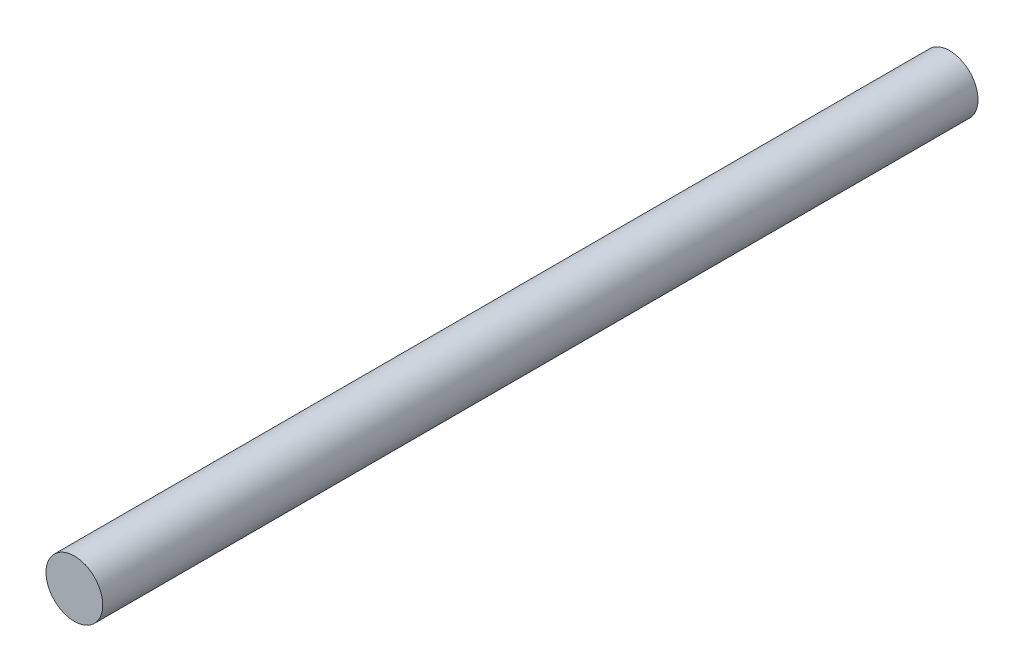
ISO-10303-21;
HEADER;
FILE_DESCRIPTION(('STEP AP214'),'2;1');
FILE_NAME('part.step','',(''),(''),'','','');
FILE_SCHEMA(('AUTOMOTIVE_DESIGN { 1 0 10303 214 1 1 1 1 }'));
ENDSEC;
DATA;
#1=APPLICATION_CONTEXT('core data for automotive mechanical design processes');
#2=APPLICATION_PROTOCOL_DEFINITION('international standard','automotive_design',2000,#1);
#3=PRODUCT_CONTEXT('',#1,'mechanical');
#4=PRODUCT('Part','Part','',(#3));
#5=PRODUCT_RELATED_PRODUCT_CATEGORY('part','',(#4));
#6=PRODUCT_DEFINITION_FORMATION('','',#4);
#7=PRODUCT_DEFINITION_CONTEXT('part definition',#1,'design');
#8=PRODUCT_DEFINITION('design','',#6,#7);
#9=PRODUCT_DEFINITION_SHAPE('','',#8);
#10=(LENGTH_UNIT() NAMED_UNIT(*) SI_UNIT(.MILLI.,.METRE.));
#11=(NAMED_UNIT(*) PLANE_ANGLE_UNIT() SI_UNIT($,.RADIAN.));
#12=(NAMED_UNIT(*) SI_UNIT($,.STERADIAN.) SOLID_ANGLE_UNIT());
#13=UNCERTAINTY_MEASURE_WITH_UNIT(LENGTH_MEASURE(1.E-05),#10,'distance_accuracy_value','');
#14=(GEOMETRIC_REPRESENTATION_CONTEXT(3) GLOBAL_UNCERTAINTY_ASSIGNED_CONTEXT((#13)) GLOBAL_UNIT_ASSIGNED_CONTEXT((#10,
#11,#12)) REPRESENTATION_CONTEXT('',''));
#15=CARTESIAN_POINT('',(0.,0.,0.));
#16=DIRECTION('',(0.,0.,1.));
#17=DIRECTION('',(1.,0.,0.));
#18=AXIS2_PLACEMENT_3D('',#15,#16,#17);
#19=CARTESIAN_POINT('',(139.1866152,19.2438528000001,0.));
#20=DIRECTION('',(0.,0.,1.));
#21=DIRECTION('',(1.,0.,0.));
#22=AXIS2_PLACEMENT_3D('',#19,#20,#21);
#23=PLANE('',#22);
#24=CARTESIAN_POINT('',(139.1866152,19.2438528000001,0.));
#25=DIRECTION('',(0.,0.,1.));
#26=DIRECTION('',(1.,0.,0.));
#27=AXIS2_PLACEMENT_3D('',#24,#25,#26);
#28=CIRCLE('',#27,11.1125);
#29=CARTESIAN_POINT('',(150.2991152,19.2438528000001,0.));
#30=VERTEX_POINT('',#29);
#31=EDGE_CURVE('E38',#30,#30,#28,.T.);
#32=ORIENTED_EDGE('',*,*,#31,.F.);
#33=EDGE_LOOP('',(#32));
#34=FACE_BOUND('',#33,.T.);
#35=ADVANCED_FACE('F31',(#34),#23,.F.);
#36=CARTESIAN_POINT('',(139.1866152,19.2438528000001,374.330896423742));
#37=DIRECTION('',(0.,0.,-1.));
#38=DIRECTION('',(-1.,0.,0.));
#39=AXIS2_PLACEMENT_3D('',#36,#37,#38);
#40=CYLINDRICAL_SURFACE('',#39,11.1125);
#41=CARTESIAN_POINT('',(139.1866152,19.2438528000001,342.9));
#42=DIRECTION('',(0.,0.,-1.));
#43=DIRECTION('',(-1.,0.,0.));
#44=AXIS2_PLACEMENT_3D('',#41,#42,#43);
#45=CIRCLE('',#44,11.1125);
#46=CARTESIAN_POINT('',(128.0741152,19.2438528000001,342.9));
#47=VERTEX_POINT('',#46);
#48=EDGE_CURVE('E10',#47,#47,#45,.T.);
#49=ORIENTED_EDGE('',*,*,#48,.T.);
#50=EDGE_LOOP('',(#49));
#51=FACE_BOUND('',#50,.T.);
#52=ORIENTED_EDGE('',*,*,#31,.T.);
#53=EDGE_LOOP('',(#52));
#54=FACE_BOUND('',#53,.T.);
#55=ADVANCED_FACE('F33',(#51,#54),#40,.T.);
#56=CARTESIAN_POINT('',(175.088921054942,5.63137049999967,342.9));
#57=DIRECTION('',(0.,0.,-1.));
#58=DIRECTION('',(0.,1.,0.));
#59=AXIS2_PLACEMENT_3D('',#56,#57,#58);
#60=PLANE('',#59);
#61=ORIENTED_EDGE('',*,*,#48,.F.);
#62=EDGE_LOOP('',(#61));
#63=FACE_BOUND('',#62,.T.);
#64=ADVANCED_FACE('F49',(#63),#60,.F.);
#65=CLOSED_SHELL('',(#35,#55,#64));
#66=MANIFOLD_SOLID_BREP('B2',#65);
#67=ADVANCED_BREP_SHAPE_REPRESENTATION('',(#18,#66),#14);
#68=SHAPE_DEFINITION_REPRESENTATION(#9,#67);
ENDSEC;
END-ISO-10303-21;
